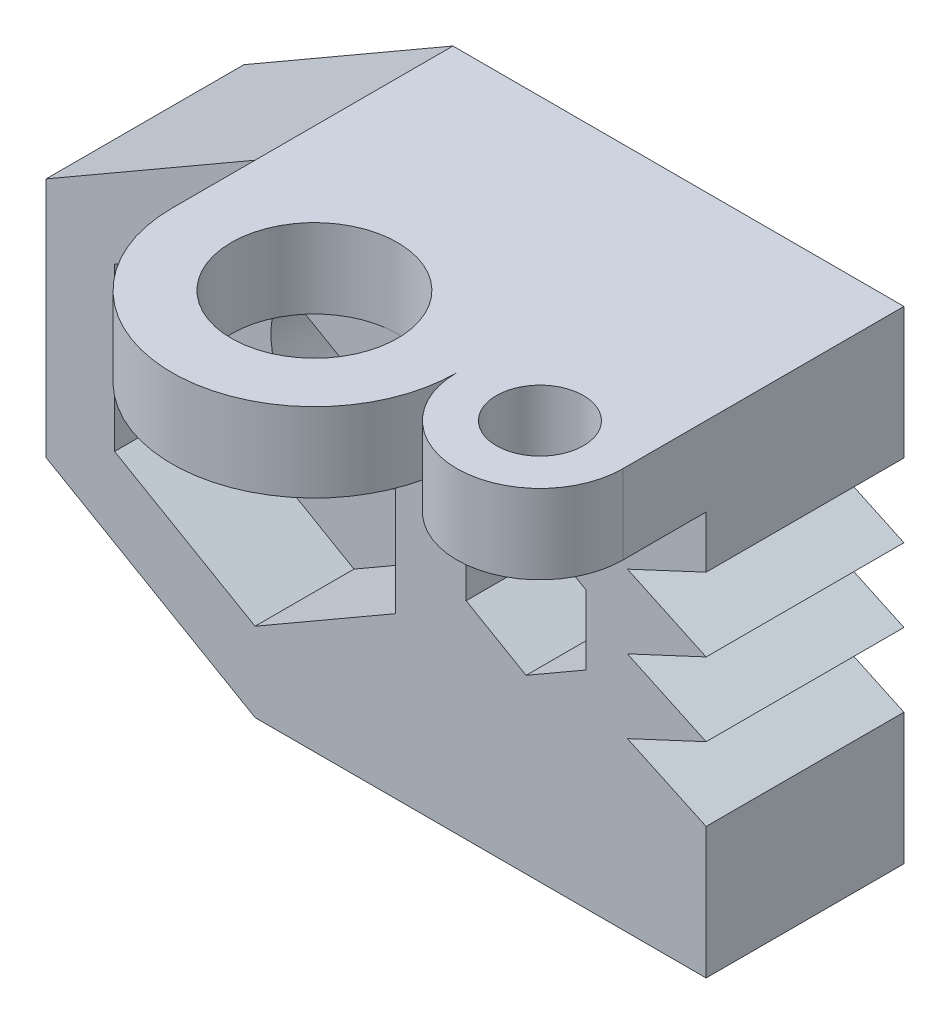
ISO-10303-21;
HEADER;
FILE_DESCRIPTION(('STEP AP214'),'2;1');
FILE_NAME('part.step','',(''),(''),'','','');
FILE_SCHEMA(('AUTOMOTIVE_DESIGN { 1 0 10303 214 1 1 1 1 }'));
ENDSEC;
DATA;
#1=APPLICATION_CONTEXT('core data for automotive mechanical design processes');
#2=APPLICATION_PROTOCOL_DEFINITION('international standard','automotive_design',2000,#1);
#3=PRODUCT_CONTEXT('',#1,'mechanical');
#4=PRODUCT('Part','Part','',(#3));
#5=PRODUCT_RELATED_PRODUCT_CATEGORY('part','',(#4));
#6=PRODUCT_DEFINITION_FORMATION('','',#4);
#7=PRODUCT_DEFINITION_CONTEXT('part definition',#1,'design');
#8=PRODUCT_DEFINITION('design','',#6,#7);
#9=PRODUCT_DEFINITION_SHAPE('','',#8);
#10=(LENGTH_UNIT() NAMED_UNIT(*) SI_UNIT(.MILLI.,.METRE.));
#11=(NAMED_UNIT(*) PLANE_ANGLE_UNIT() SI_UNIT($,.RADIAN.));
#12=(NAMED_UNIT(*) SI_UNIT($,.STERADIAN.) SOLID_ANGLE_UNIT());
#13=UNCERTAINTY_MEASURE_WITH_UNIT(LENGTH_MEASURE(1.E-05),#10,'distance_accuracy_value','');
#14=(GEOMETRIC_REPRESENTATION_CONTEXT(3) GLOBAL_UNCERTAINTY_ASSIGNED_CONTEXT((#13)) GLOBAL_UNIT_ASSIGNED_CONTEXT((#10,
#11,#12)) REPRESENTATION_CONTEXT('',''));
#15=CARTESIAN_POINT('',(0.,0.,0.));
#16=DIRECTION('',(0.,0.,1.));
#17=DIRECTION('',(1.,0.,0.));
#18=AXIS2_PLACEMENT_3D('',#15,#16,#17);
#19=CARTESIAN_POINT('',(22.8,-12.2,10.));
#20=DIRECTION('',(0.,0.,-1.));
#21=DIRECTION('',(-1.,0.,0.));
#22=AXIS2_PLACEMENT_3D('',#19,#20,#21);
#23=PLANE('',#22);
#24=DIRECTION('',(-0.866025403784439,0.499999999999999,0.));
#25=VECTOR('',#24,1.);
#26=CARTESIAN_POINT('',(16.7310889132455,1.75,10.));
#27=LINE('',#26,#25);
#28=CARTESIAN_POINT('',(16.7310889132455,1.75,10.));
#29=VERTEX_POINT('',#28);
#30=CARTESIAN_POINT('',(13.7,3.5,10.));
#31=VERTEX_POINT('',#30);
#32=EDGE_CURVE('E340',#29,#31,#27,.T.);
#33=ORIENTED_EDGE('',*,*,#32,.F.);
#34=DIRECTION('',(0.,1.,0.));
#35=VECTOR('',#34,1.);
#36=CARTESIAN_POINT('',(16.7310889132455,-1.75,10.));
#37=LINE('',#36,#35);
#38=CARTESIAN_POINT('',(16.7310889132455,-1.75,10.));
#39=VERTEX_POINT('',#38);
#40=EDGE_CURVE('E318',#39,#29,#37,.T.);
#41=ORIENTED_EDGE('',*,*,#40,.F.);
#42=DIRECTION('',(0.866025403784439,0.5,0.));
#43=VECTOR('',#42,1.);
#44=CARTESIAN_POINT('',(13.7,-3.5,10.));
#45=LINE('',#44,#43);
#46=CARTESIAN_POINT('',(13.7,-3.5,10.));
#47=VERTEX_POINT('',#46);
#48=EDGE_CURVE('E323',#47,#39,#45,.T.);
#49=ORIENTED_EDGE('',*,*,#48,.F.);
#50=DIRECTION('',(0.866025403784439,-0.5,0.));
#51=VECTOR('',#50,1.);
#52=CARTESIAN_POINT('',(10.6689110867545,-1.75,10.));
#53=LINE('',#52,#51);
#54=CARTESIAN_POINT('',(10.6689110867545,-1.75,10.));
#55=VERTEX_POINT('',#54);
#56=EDGE_CURVE('E349',#55,#47,#53,.T.);
#57=ORIENTED_EDGE('',*,*,#56,.F.);
#58=DIRECTION('',(0.,-1.,0.));
#59=VECTOR('',#58,1.);
#60=CARTESIAN_POINT('',(10.6689110867545,1.75,10.));
#61=LINE('',#60,#59);
#62=CARTESIAN_POINT('',(10.6689110867545,1.75,10.));
#63=VERTEX_POINT('',#62);
#64=EDGE_CURVE('E346',#63,#55,#61,.T.);
#65=ORIENTED_EDGE('',*,*,#64,.F.);
#66=DIRECTION('',(-0.866025403784438,-0.5,0.));
#67=VECTOR('',#66,1.);
#68=CARTESIAN_POINT('',(13.7,3.5,10.));
#69=LINE('',#68,#67);
#70=EDGE_CURVE('E343',#31,#63,#69,.T.);
#71=ORIENTED_EDGE('',*,*,#70,.F.);
#72=EDGE_LOOP('',(#33,#41,#49,#57,#65,#71));
#73=FACE_BOUND('',#72,.T.);
#74=DIRECTION('',(-0.90630778703665,-0.422618261740699,0.));
#75=VECTOR('',#74,1.);
#76=CARTESIAN_POINT('',(17.4165931832703,-0.655246825604867,10.));
#77=LINE('',#76,#75);
#78=CARTESIAN_POINT('',(22.8,1.855077,10.));
#79=VERTEX_POINT('',#78);
#80=CARTESIAN_POINT('',(18.8217745354219,0.,10.));
#81=VERTEX_POINT('',#80);
#82=EDGE_CURVE('E232',#79,#81,#77,.T.);
#83=ORIENTED_EDGE('',*,*,#82,.F.);
#84=DIRECTION('',(0.906307787036651,-0.422618261740698,0.));
#85=VECTOR('',#84,1.);
#86=CARTESIAN_POINT('',(28.1834068167297,-0.655246825604855,10.));
#87=LINE('',#86,#85);
#88=CARTESIAN_POINT('',(18.8217745354219,3.71015399999999,10.));
#89=VERTEX_POINT('',#88);
#90=EDGE_CURVE('E260',#89,#79,#87,.T.);
#91=ORIENTED_EDGE('',*,*,#90,.F.);
#92=DIRECTION('',(-0.90630778703665,-0.4226182617407,0.));
#93=VECTOR('',#92,1.);
#94=CARTESIAN_POINT('',(15.9955217558625,2.3922506850096,10.));
#95=LINE('',#94,#93);
#96=CARTESIAN_POINT('',(22.8,5.565231,10.));
#97=VERTEX_POINT('',#96);
#98=EDGE_CURVE('E263',#97,#89,#95,.T.);
#99=ORIENTED_EDGE('',*,*,#98,.F.);
#100=DIRECTION('',(0.,1.,0.));
#101=VECTOR('',#100,1.);
#102=CARTESIAN_POINT('',(22.8,12.2,10.));
#103=LINE('',#102,#101);
#104=CARTESIAN_POINT('',(22.8,8.20000000000001,10.));
#105=VERTEX_POINT('',#104);
#106=EDGE_CURVE('E428',#97,#105,#103,.T.);
#107=ORIENTED_EDGE('',*,*,#106,.T.);
#108=DIRECTION('',(1.,0.,0.));
#109=VECTOR('',#108,1.);
#110=CARTESIAN_POINT('',(22.8,8.20000000000001,10.));
#111=LINE('',#110,#109);
#112=CARTESIAN_POINT('',(7.2,8.2,10.));
#113=VERTEX_POINT('',#112);
#114=EDGE_CURVE('E61',#113,#105,#111,.T.);
#115=ORIENTED_EDGE('',*,*,#114,.F.);
#116=CARTESIAN_POINT('',(0.,8.2,10.));
#117=VERTEX_POINT('',#116);
#118=EDGE_CURVE('E315',#117,#113,#111,.T.);
#119=ORIENTED_EDGE('',*,*,#118,.F.);
#120=DIRECTION('',(-0.866025403784439,0.5,0.));
#121=VECTOR('',#120,1.);
#122=CARTESIAN_POINT('',(7.10140831103239,4.1,10.));
#123=LINE('',#122,#121);
#124=CARTESIAN_POINT('',(7.10140831103239,4.1,10.));
#125=VERTEX_POINT('',#124);
#126=EDGE_CURVE('E398',#125,#117,#123,.T.);
#127=ORIENTED_EDGE('',*,*,#126,.F.);
#128=DIRECTION('',(0.,1.,0.));
#129=VECTOR('',#128,1.);
#130=CARTESIAN_POINT('',(7.10140831103239,-4.1,10.));
#131=LINE('',#130,#129);
#132=CARTESIAN_POINT('',(7.10140831103239,-4.1,10.));
#133=VERTEX_POINT('',#132);
#134=EDGE_CURVE('E395',#133,#125,#131,.T.);
#135=ORIENTED_EDGE('',*,*,#134,.F.);
#136=DIRECTION('',(0.866025403784439,0.5,0.));
#137=VECTOR('',#136,1.);
#138=CARTESIAN_POINT('',(0.,-8.2,10.));
#139=LINE('',#138,#137);
#140=CARTESIAN_POINT('',(0.,-8.2,10.));
#141=VERTEX_POINT('',#140);
#142=EDGE_CURVE('E392',#141,#133,#139,.T.);
#143=ORIENTED_EDGE('',*,*,#142,.F.);
#144=DIRECTION('',(0.866025403784439,-0.5,0.));
#145=VECTOR('',#144,1.);
#146=CARTESIAN_POINT('',(-7.1014083110324,-4.1,10.));
#147=LINE('',#146,#145);
#148=CARTESIAN_POINT('',(-7.10140831103239,-4.1,10.));
#149=VERTEX_POINT('',#148);
#150=EDGE_CURVE('E389',#149,#141,#147,.T.);
#151=ORIENTED_EDGE('',*,*,#150,.F.);
#152=DIRECTION('',(0.,-1.,0.));
#153=VECTOR('',#152,1.);
#154=CARTESIAN_POINT('',(-7.1014083110324,4.1,10.));
#155=LINE('',#154,#153);
#156=CARTESIAN_POINT('',(-7.1014083110324,4.1,10.));
#157=VERTEX_POINT('',#156);
#158=EDGE_CURVE('E387',#157,#149,#155,.T.);
#159=ORIENTED_EDGE('',*,*,#158,.F.);
#160=DIRECTION('',(-0.866025403784439,-0.5,0.));
#161=VECTOR('',#160,1.);
#162=CARTESIAN_POINT('',(0.,8.2,10.));
#163=LINE('',#162,#161);
#164=EDGE_CURVE('E371',#117,#157,#163,.T.);
#165=ORIENTED_EDGE('',*,*,#164,.F.);
#166=DIRECTION('',(0.,1.,0.));
#167=VECTOR('',#166,1.);
#168=CARTESIAN_POINT('',(0.,-12.2,10.));
#169=LINE('',#168,#167);
#170=CARTESIAN_POINT('',(0.,12.2,10.));
#171=VERTEX_POINT('',#170);
#172=EDGE_CURVE('E316',#117,#171,#169,.T.);
#173=ORIENTED_EDGE('',*,*,#172,.T.);
#174=DIRECTION('',(-0.866025403784439,-0.5,0.));
#175=VECTOR('',#174,1.);
#176=CARTESIAN_POINT('',(0.,12.2,10.));
#177=LINE('',#176,#175);
#178=CARTESIAN_POINT('',(-10.5655099261702,6.1,10.));
#179=VERTEX_POINT('',#178);
#180=EDGE_CURVE('E427',#171,#179,#177,.T.);
#181=ORIENTED_EDGE('',*,*,#180,.T.);
#182=DIRECTION('',(0.,-1.,0.));
#183=VECTOR('',#182,1.);
#184=CARTESIAN_POINT('',(-10.5655099261702,6.1,10.));
#185=LINE('',#184,#183);
#186=CARTESIAN_POINT('',(-10.5655099261702,-6.1,10.));
#187=VERTEX_POINT('',#186);
#188=EDGE_CURVE('E430',#179,#187,#185,.T.);
#189=ORIENTED_EDGE('',*,*,#188,.T.);
#190=DIRECTION('',(0.866025403784439,-0.5,0.));
#191=VECTOR('',#190,1.);
#192=CARTESIAN_POINT('',(-10.5655099261702,-6.1,10.));
#193=LINE('',#192,#191);
#194=CARTESIAN_POINT('',(0.,-12.2,10.));
#195=VERTEX_POINT('',#194);
#196=EDGE_CURVE('E432',#187,#195,#193,.T.);
#197=ORIENTED_EDGE('',*,*,#196,.T.);
#198=DIRECTION('',(1.,0.,0.));
#199=VECTOR('',#198,1.);
#200=CARTESIAN_POINT('',(22.8,-12.2,10.));
#201=LINE('',#200,#199);
#202=CARTESIAN_POINT('',(22.8,-12.2,10.));
#203=VERTEX_POINT('',#202);
#204=EDGE_CURVE('E434',#195,#203,#201,.T.);
#205=ORIENTED_EDGE('',*,*,#204,.T.);
#206=CARTESIAN_POINT('',(22.8,-5.565231,10.));
#207=VERTEX_POINT('',#206);
#208=EDGE_CURVE('E424',#203,#207,#103,.T.);
#209=ORIENTED_EDGE('',*,*,#208,.T.);
#210=DIRECTION('',(0.906307787036651,-0.422618261740697,0.));
#211=VECTOR('',#210,1.);
#212=CARTESIAN_POINT('',(25.341263961914,-6.75024184683381,10.));
#213=LINE('',#212,#211);
#214=CARTESIAN_POINT('',(18.8217745354219,-3.71015400000001,10.));
#215=VERTEX_POINT('',#214);
#216=EDGE_CURVE('E53',#215,#207,#213,.T.);
#217=ORIENTED_EDGE('',*,*,#216,.F.);
#218=DIRECTION('',(-0.90630778703665,-0.4226182617407,0.));
#219=VECTOR('',#218,1.);
#220=CARTESIAN_POINT('',(18.8376646106781,-3.70274433621936,10.));
#221=LINE('',#220,#219);
#222=CARTESIAN_POINT('',(22.8,-1.85507700000001,10.));
#223=VERTEX_POINT('',#222);
#224=EDGE_CURVE('E273',#223,#215,#221,.T.);
#225=ORIENTED_EDGE('',*,*,#224,.F.);
#226=DIRECTION('',(0.906307787036649,-0.422618261740701,0.));
#227=VECTOR('',#226,1.);
#228=CARTESIAN_POINT('',(26.7623353893219,-3.70274433621937,10.));
#229=LINE('',#228,#227);
#230=EDGE_CURVE('E253',#81,#223,#229,.T.);
#231=ORIENTED_EDGE('',*,*,#230,.F.);
#232=EDGE_LOOP('',(#83,#91,#99,#107,#115,#119,#127,#135,#143,#151,#159,#165,#173,#181,#189,#197,
#205,#209,#217,#225,#231));
#233=FACE_BOUND('',#232,.T.);
#234=ADVANCED_FACE('F38',(#73,#233),#23,.F.);
#235=CARTESIAN_POINT('',(22.8,-12.2,0.));
#236=DIRECTION('',(0.,0.,-1.));
#237=DIRECTION('',(-1.,0.,0.));
#238=AXIS2_PLACEMENT_3D('',#235,#236,#237);
#239=PLANE('',#238);
#240=CARTESIAN_POINT('',(13.7,0.,0.));
#241=DIRECTION('',(0.,0.,1.));
#242=DIRECTION('',(1.,0.,0.));
#243=AXIS2_PLACEMENT_3D('',#240,#241,#242);
#244=CIRCLE('',#243,2.20000000000001);
#245=CARTESIAN_POINT('',(15.9,0.,0.));
#246=VERTEX_POINT('',#245);
#247=EDGE_CURVE('E417',#246,#246,#244,.T.);
#248=ORIENTED_EDGE('',*,*,#247,.T.);
#249=EDGE_LOOP('',(#248));
#250=FACE_BOUND('',#249,.T.);
#251=CARTESIAN_POINT('',(0.,0.,0.));
#252=DIRECTION('',(0.,0.,1.));
#253=DIRECTION('',(1.,0.,0.));
#254=AXIS2_PLACEMENT_3D('',#251,#252,#253);
#255=CIRCLE('',#254,4.2);
#256=CARTESIAN_POINT('',(4.2,0.,0.));
#257=VERTEX_POINT('',#256);
#258=EDGE_CURVE('E420',#257,#257,#255,.T.);
#259=ORIENTED_EDGE('',*,*,#258,.T.);
#260=EDGE_LOOP('',(#259));
#261=FACE_BOUND('',#260,.T.);
#262=DIRECTION('',(0.906307787036651,-0.422618261740698,0.));
#263=VECTOR('',#262,1.);
#264=CARTESIAN_POINT('',(25.4523023542834,0.618288100455125,0.));
#265=LINE('',#264,#263);
#266=CARTESIAN_POINT('',(18.8217745354219,3.71015399999999,0.));
#267=VERTEX_POINT('',#266);
#268=CARTESIAN_POINT('',(22.8,1.855077,0.));
#269=VERTEX_POINT('',#268);
#270=EDGE_CURVE('E249',#267,#269,#265,.T.);
#271=ORIENTED_EDGE('',*,*,#270,.T.);
#272=DIRECTION('',(-0.90630778703665,-0.422618261740699,0.));
#273=VECTOR('',#272,1.);
#274=CARTESIAN_POINT('',(16.8800078948424,-0.905460654852126,0.));
#275=LINE('',#274,#273);
#276=CARTESIAN_POINT('',(18.8217745354219,0.,0.));
#277=VERTEX_POINT('',#276);
#278=EDGE_CURVE('E229',#269,#277,#275,.T.);
#279=ORIENTED_EDGE('',*,*,#278,.T.);
#280=DIRECTION('',(0.906307787036649,-0.422618261740701,0.));
#281=VECTOR('',#280,1.);
#282=CARTESIAN_POINT('',(24.0312309268756,-2.42920941015938,0.));
#283=LINE('',#282,#281);
#284=CARTESIAN_POINT('',(22.8,-1.85507700000001,0.));
#285=VERTEX_POINT('',#284);
#286=EDGE_CURVE('E235',#277,#285,#283,.T.);
#287=ORIENTED_EDGE('',*,*,#286,.T.);
#288=DIRECTION('',(-0.90630778703665,-0.4226182617407,0.));
#289=VECTOR('',#288,1.);
#290=CARTESIAN_POINT('',(18.3010793222502,-3.95295816546662,0.));
#291=LINE('',#290,#289);
#292=CARTESIAN_POINT('',(18.8217745354219,-3.71015400000001,0.));
#293=VERTEX_POINT('',#292);
#294=EDGE_CURVE('E265',#285,#293,#291,.T.);
#295=ORIENTED_EDGE('',*,*,#294,.T.);
#296=DIRECTION('',(0.906307787036651,-0.422618261740697,0.));
#297=VECTOR('',#296,1.);
#298=CARTESIAN_POINT('',(22.6101594994678,-5.47670692077384,0.));
#299=LINE('',#298,#297);
#300=CARTESIAN_POINT('',(22.8,-5.565231,0.));
#301=VERTEX_POINT('',#300);
#302=EDGE_CURVE('E267',#293,#301,#299,.T.);
#303=ORIENTED_EDGE('',*,*,#302,.T.);
#304=DIRECTION('',(0.,1.,0.));
#305=VECTOR('',#304,1.);
#306=CARTESIAN_POINT('',(22.8,12.2,0.));
#307=LINE('',#306,#305);
#308=CARTESIAN_POINT('',(22.8,-12.2,0.));
#309=VERTEX_POINT('',#308);
#310=EDGE_CURVE('E437',#309,#301,#307,.T.);
#311=ORIENTED_EDGE('',*,*,#310,.F.);
#312=DIRECTION('',(1.,0.,0.));
#313=VECTOR('',#312,1.);
#314=CARTESIAN_POINT('',(22.8,-12.2,0.));
#315=LINE('',#314,#313);
#316=CARTESIAN_POINT('',(0.,-12.2,0.));
#317=VERTEX_POINT('',#316);
#318=EDGE_CURVE('E448',#317,#309,#315,.T.);
#319=ORIENTED_EDGE('',*,*,#318,.F.);
#320=DIRECTION('',(0.866025403784439,-0.5,0.));
#321=VECTOR('',#320,1.);
#322=CARTESIAN_POINT('',(-10.5655099261702,-6.1,0.));
#323=LINE('',#322,#321);
#324=CARTESIAN_POINT('',(-10.5655099261702,-6.1,0.));
#325=VERTEX_POINT('',#324);
#326=EDGE_CURVE('E446',#325,#317,#323,.T.);
#327=ORIENTED_EDGE('',*,*,#326,.F.);
#328=DIRECTION('',(0.,-1.,0.));
#329=VECTOR('',#328,1.);
#330=CARTESIAN_POINT('',(-10.5655099261702,6.1,0.));
#331=LINE('',#330,#329);
#332=CARTESIAN_POINT('',(-10.5655099261702,6.1,0.));
#333=VERTEX_POINT('',#332);
#334=EDGE_CURVE('E444',#333,#325,#331,.T.);
#335=ORIENTED_EDGE('',*,*,#334,.F.);
#336=DIRECTION('',(-0.866025403784439,-0.5,0.));
#337=VECTOR('',#336,1.);
#338=CARTESIAN_POINT('',(0.,12.2,0.));
#339=LINE('',#338,#337);
#340=CARTESIAN_POINT('',(0.,12.2,0.));
#341=VERTEX_POINT('',#340);
#342=EDGE_CURVE('E442',#341,#333,#339,.T.);
#343=ORIENTED_EDGE('',*,*,#342,.F.);
#344=DIRECTION('',(-1.,0.,0.));
#345=VECTOR('',#344,1.);
#346=CARTESIAN_POINT('',(0.,12.2,0.));
#347=LINE('',#346,#345);
#348=CARTESIAN_POINT('',(22.8,12.2,0.));
#349=VERTEX_POINT('',#348);
#350=EDGE_CURVE('E440',#349,#341,#347,.T.);
#351=ORIENTED_EDGE('',*,*,#350,.F.);
#352=CARTESIAN_POINT('',(22.8,5.565231,0.));
#353=VERTEX_POINT('',#352);
#354=EDGE_CURVE('E423',#353,#349,#307,.T.);
#355=ORIENTED_EDGE('',*,*,#354,.F.);
#356=DIRECTION('',(-0.90630778703665,-0.4226182617407,0.));
#357=VECTOR('',#356,1.);
#358=CARTESIAN_POINT('',(15.4589364674346,2.14203685576234,0.));
#359=LINE('',#358,#357);
#360=EDGE_CURVE('E255',#353,#267,#359,.T.);
#361=ORIENTED_EDGE('',*,*,#360,.T.);
#362=EDGE_LOOP('',(#271,#279,#287,#295,#303,#311,#319,#327,#335,#343,#351,#355,#361));
#363=FACE_BOUND('',#362,.T.);
#364=ADVANCED_FACE('F246',(#250,#261,#363),#239,.T.);
#365=CARTESIAN_POINT('',(22.8,12.2,10.));
#366=DIRECTION('',(-1.,0.,0.));
#367=DIRECTION('',(0.,-1.,0.));
#368=AXIS2_PLACEMENT_3D('',#365,#366,#367);
#369=PLANE('',#368);
#370=DIRECTION('',(0.,0.,1.));
#371=VECTOR('',#370,1.);
#372=CARTESIAN_POINT('',(22.8,5.565231,10.));
#373=LINE('',#372,#371);
#374=EDGE_CURVE('E12',#353,#97,#373,.T.);
#375=ORIENTED_EDGE('',*,*,#374,.F.);
#376=ORIENTED_EDGE('',*,*,#354,.T.);
#377=DIRECTION('',(0.,0.,-1.));
#378=VECTOR('',#377,1.);
#379=CARTESIAN_POINT('',(22.8,12.2,10.));
#380=LINE('',#379,#378);
#381=CARTESIAN_POINT('',(22.8,12.2,14.2));
#382=VERTEX_POINT('',#381);
#383=EDGE_CURVE('E464',#382,#349,#380,.T.);
#384=ORIENTED_EDGE('',*,*,#383,.F.);
#385=DIRECTION('',(0.,1.,0.));
#386=VECTOR('',#385,1.);
#387=CARTESIAN_POINT('',(22.8,8.20000000000001,14.2));
#388=LINE('',#387,#386);
#389=CARTESIAN_POINT('',(22.8,8.20000000000001,14.2));
#390=VERTEX_POINT('',#389);
#391=EDGE_CURVE('E307',#390,#382,#388,.T.);
#392=ORIENTED_EDGE('',*,*,#391,.F.);
#393=DIRECTION('',(0.,0.,-1.));
#394=VECTOR('',#393,1.);
#395=CARTESIAN_POINT('',(22.8,8.20000000000001,0.));
#396=LINE('',#395,#394);
#397=EDGE_CURVE('E297',#390,#105,#396,.T.);
#398=ORIENTED_EDGE('',*,*,#397,.T.);
#399=ORIENTED_EDGE('',*,*,#106,.F.);
#400=EDGE_LOOP('',(#375,#376,#384,#392,#398,#399));
#401=FACE_BOUND('',#400,.T.);
#402=ADVANCED_FACE('F40',(#401),#369,.F.);
#403=DIRECTION('',(0.,0.,-1.));
#404=VECTOR('',#403,1.);
#405=CARTESIAN_POINT('',(22.8,-5.565231,10.));
#406=LINE('',#405,#404);
#407=EDGE_CURVE('E467',#207,#301,#406,.T.);
#408=ORIENTED_EDGE('',*,*,#407,.F.);
#409=ORIENTED_EDGE('',*,*,#208,.F.);
#410=DIRECTION('',(0.,0.,-1.));
#411=VECTOR('',#410,1.);
#412=CARTESIAN_POINT('',(22.8,-12.2,10.));
#413=LINE('',#412,#411);
#414=EDGE_CURVE('E436',#203,#309,#413,.T.);
#415=ORIENTED_EDGE('',*,*,#414,.T.);
#416=ORIENTED_EDGE('',*,*,#310,.T.);
#417=EDGE_LOOP('',(#408,#409,#415,#416));
#418=FACE_BOUND('',#417,.T.);
#419=ADVANCED_FACE('F485',(#418),#369,.F.);
#420=CARTESIAN_POINT('',(13.7,0.,10.));
#421=DIRECTION('',(0.,0.,-1.));
#422=DIRECTION('',(-1.,0.,0.));
#423=AXIS2_PLACEMENT_3D('',#420,#421,#422);
#424=CYLINDRICAL_SURFACE('',#423,2.20000000000001);
#425=ORIENTED_EDGE('',*,*,#247,.F.);
#426=EDGE_LOOP('',(#425));
#427=FACE_BOUND('',#426,.T.);
#428=CARTESIAN_POINT('',(13.7,0.,5.));
#429=DIRECTION('',(0.,0.,1.));
#430=DIRECTION('',(1.,0.,0.));
#431=AXIS2_PLACEMENT_3D('',#428,#429,#430);
#432=CIRCLE('',#431,2.20000000000001);
#433=CARTESIAN_POINT('',(15.9,0.,5.));
#434=VERTEX_POINT('',#433);
#435=EDGE_CURVE('E356',#434,#434,#432,.T.);
#436=ORIENTED_EDGE('',*,*,#435,.T.);
#437=EDGE_LOOP('',(#436));
#438=FACE_BOUND('',#437,.T.);
#439=ADVANCED_FACE('F562',(#427,#438),#424,.F.);
#440=CARTESIAN_POINT('',(0.,0.,10.));
#441=DIRECTION('',(0.,0.,-1.));
#442=DIRECTION('',(-1.,0.,0.));
#443=AXIS2_PLACEMENT_3D('',#440,#441,#442);
#444=CYLINDRICAL_SURFACE('',#443,4.2);
#445=ORIENTED_EDGE('',*,*,#258,.F.);
#446=EDGE_LOOP('',(#445));
#447=FACE_BOUND('',#446,.T.);
#448=CARTESIAN_POINT('',(0.,0.,5.));
#449=DIRECTION('',(0.,0.,1.));
#450=DIRECTION('',(1.,0.,0.));
#451=AXIS2_PLACEMENT_3D('',#448,#449,#450);
#452=CIRCLE('',#451,4.2);
#453=CARTESIAN_POINT('',(4.2,0.,5.));
#454=VERTEX_POINT('',#453);
#455=EDGE_CURVE('E405',#454,#454,#452,.T.);
#456=ORIENTED_EDGE('',*,*,#455,.T.);
#457=EDGE_LOOP('',(#456));
#458=FACE_BOUND('',#457,.T.);
#459=ADVANCED_FACE('F546',(#447,#458),#444,.F.);
#460=CARTESIAN_POINT('',(0.,12.2,10.));
#461=DIRECTION('',(0.,-1.,0.));
#462=DIRECTION('',(1.,0.,0.));
#463=AXIS2_PLACEMENT_3D('',#460,#461,#462);
#464=PLANE('',#463);
#465=CARTESIAN_POINT('',(7.2,12.2,14.2));
#466=DIRECTION('',(0.,1.,0.));
#467=DIRECTION('',(-1.,0.,0.));
#468=AXIS2_PLACEMENT_3D('',#465,#466,#467);
#469=CIRCLE('',#468,4.2);
#470=CARTESIAN_POINT('',(3.,12.2,14.2));
#471=VERTEX_POINT('',#470);
#472=EDGE_CURVE('E279',#471,#471,#469,.T.);
#473=ORIENTED_EDGE('',*,*,#472,.F.);
#474=EDGE_LOOP('',(#473));
#475=FACE_BOUND('',#474,.T.);
#476=ORIENTED_EDGE('',*,*,#350,.T.);
#477=DIRECTION('',(0.,0.,-1.));
#478=VECTOR('',#477,1.);
#479=CARTESIAN_POINT('',(0.,12.2,10.));
#480=LINE('',#479,#478);
#481=EDGE_CURVE('E461',#171,#341,#480,.T.);
#482=ORIENTED_EDGE('',*,*,#481,.F.);
#483=DIRECTION('',(0.,0.,1.));
#484=VECTOR('',#483,1.);
#485=CARTESIAN_POINT('',(0.,12.2,0.));
#486=LINE('',#485,#484);
#487=CARTESIAN_POINT('',(0.,12.2,14.2));
#488=VERTEX_POINT('',#487);
#489=EDGE_CURVE('E285',#171,#488,#486,.T.);
#490=ORIENTED_EDGE('',*,*,#489,.T.);
#491=CARTESIAN_POINT('',(7.2,12.2,14.2));
#492=DIRECTION('',(0.,1.,0.));
#493=DIRECTION('',(-1.,0.,0.));
#494=AXIS2_PLACEMENT_3D('',#491,#492,#493);
#495=CIRCLE('',#494,7.2);
#496=CARTESIAN_POINT('',(14.4,12.2,14.2));
#497=VERTEX_POINT('',#496);
#498=EDGE_CURVE('E302',#488,#497,#495,.T.);
#499=ORIENTED_EDGE('',*,*,#498,.T.);
#500=CARTESIAN_POINT('',(18.6,12.2,14.2));
#501=DIRECTION('',(0.,1.,0.));
#502=DIRECTION('',(1.,0.,0.));
#503=AXIS2_PLACEMENT_3D('',#500,#501,#502);
#504=CIRCLE('',#503,4.2);
#505=EDGE_CURVE('E291',#497,#382,#504,.T.);
#506=ORIENTED_EDGE('',*,*,#505,.T.);
#507=ORIENTED_EDGE('',*,*,#383,.T.);
#508=EDGE_LOOP('',(#476,#482,#490,#499,#506,#507));
#509=FACE_BOUND('',#508,.T.);
#510=CARTESIAN_POINT('',(18.6,12.2,14.2));
#511=DIRECTION('',(0.,1.,0.));
#512=DIRECTION('',(-1.,0.,0.));
#513=AXIS2_PLACEMENT_3D('',#510,#511,#512);
#514=CIRCLE('',#513,2.2);
#515=CARTESIAN_POINT('',(16.4,12.2,14.2));
#516=VERTEX_POINT('',#515);
#517=EDGE_CURVE('E275',#516,#516,#514,.T.);
#518=ORIENTED_EDGE('',*,*,#517,.F.);
#519=EDGE_LOOP('',(#518));
#520=FACE_BOUND('',#519,.T.);
#521=ADVANCED_FACE('F511',(#475,#509,#520),#464,.F.);
#522=CARTESIAN_POINT('',(0.,12.2,10.));
#523=DIRECTION('',(0.5,-0.866025403784439,0.));
#524=DIRECTION('',(0.866025403784439,0.5,0.));
#525=AXIS2_PLACEMENT_3D('',#522,#523,#524);
#526=PLANE('',#525);
#527=ORIENTED_EDGE('',*,*,#342,.T.);
#528=DIRECTION('',(0.,0.,-1.));
#529=VECTOR('',#528,1.);
#530=CARTESIAN_POINT('',(-10.5655099261702,6.1,10.));
#531=LINE('',#530,#529);
#532=EDGE_CURVE('E458',#179,#333,#531,.T.);
#533=ORIENTED_EDGE('',*,*,#532,.F.);
#534=ORIENTED_EDGE('',*,*,#180,.F.);
#535=ORIENTED_EDGE('',*,*,#481,.T.);
#536=EDGE_LOOP('',(#527,#533,#534,#535));
#537=FACE_BOUND('',#536,.T.);
#538=ADVANCED_FACE('F505',(#537),#526,.F.);
#539=CARTESIAN_POINT('',(-10.5655099261702,6.1,10.));
#540=DIRECTION('',(1.,0.,0.));
#541=DIRECTION('',(0.,1.,0.));
#542=AXIS2_PLACEMENT_3D('',#539,#540,#541);
#543=PLANE('',#542);
#544=ORIENTED_EDGE('',*,*,#334,.T.);
#545=DIRECTION('',(0.,0.,-1.));
#546=VECTOR('',#545,1.);
#547=CARTESIAN_POINT('',(-10.5655099261702,-6.1,10.));
#548=LINE('',#547,#546);
#549=EDGE_CURVE('E455',#187,#325,#548,.T.);
#550=ORIENTED_EDGE('',*,*,#549,.F.);
#551=ORIENTED_EDGE('',*,*,#188,.F.);
#552=ORIENTED_EDGE('',*,*,#532,.T.);
#553=EDGE_LOOP('',(#544,#550,#551,#552));
#554=FACE_BOUND('',#553,.T.);
#555=ADVANCED_FACE('F501',(#554),#543,.F.);
#556=CARTESIAN_POINT('',(-10.5655099261702,-6.1,10.));
#557=DIRECTION('',(0.5,0.866025403784439,0.));
#558=DIRECTION('',(-0.866025403784439,0.5,0.));
#559=AXIS2_PLACEMENT_3D('',#556,#557,#558);
#560=PLANE('',#559);
#561=ORIENTED_EDGE('',*,*,#326,.T.);
#562=DIRECTION('',(0.,0.,-1.));
#563=VECTOR('',#562,1.);
#564=CARTESIAN_POINT('',(0.,-12.2,10.));
#565=LINE('',#564,#563);
#566=EDGE_CURVE('E452',#195,#317,#565,.T.);
#567=ORIENTED_EDGE('',*,*,#566,.F.);
#568=ORIENTED_EDGE('',*,*,#196,.F.);
#569=ORIENTED_EDGE('',*,*,#549,.T.);
#570=EDGE_LOOP('',(#561,#567,#568,#569));
#571=FACE_BOUND('',#570,.T.);
#572=ADVANCED_FACE('F496',(#571),#560,.F.);
#573=CARTESIAN_POINT('',(22.8,-12.2,10.));
#574=DIRECTION('',(0.,1.,0.));
#575=DIRECTION('',(0.,0.,1.));
#576=AXIS2_PLACEMENT_3D('',#573,#574,#575);
#577=PLANE('',#576);
#578=ORIENTED_EDGE('',*,*,#318,.T.);
#579=ORIENTED_EDGE('',*,*,#414,.F.);
#580=ORIENTED_EDGE('',*,*,#204,.F.);
#581=ORIENTED_EDGE('',*,*,#566,.T.);
#582=EDGE_LOOP('',(#578,#579,#580,#581));
#583=FACE_BOUND('',#582,.T.);
#584=ADVANCED_FACE('F490',(#583),#577,.F.);
#585=CARTESIAN_POINT('',(-7.1014083110324,4.1,5.));
#586=DIRECTION('',(-1.,0.,0.));
#587=DIRECTION('',(0.,-1.,0.));
#588=AXIS2_PLACEMENT_3D('',#585,#586,#587);
#589=PLANE('',#588);
#590=ORIENTED_EDGE('',*,*,#158,.T.);
#591=DIRECTION('',(0.,0.,1.));
#592=VECTOR('',#591,1.);
#593=CARTESIAN_POINT('',(-7.1014083110324,-4.1,5.));
#594=LINE('',#593,#592);
#595=CARTESIAN_POINT('',(-7.1014083110324,-4.1,5.));
#596=VERTEX_POINT('',#595);
#597=EDGE_CURVE('E386',#596,#149,#594,.T.);
#598=ORIENTED_EDGE('',*,*,#597,.F.);
#599=DIRECTION('',(0.,-1.,0.));
#600=VECTOR('',#599,1.);
#601=CARTESIAN_POINT('',(-7.1014083110324,4.1,5.));
#602=LINE('',#601,#600);
#603=CARTESIAN_POINT('',(-7.1014083110324,4.1,5.));
#604=VERTEX_POINT('',#603);
#605=EDGE_CURVE('E367',#604,#596,#602,.T.);
#606=ORIENTED_EDGE('',*,*,#605,.F.);
#607=DIRECTION('',(0.,0.,1.));
#608=VECTOR('',#607,1.);
#609=CARTESIAN_POINT('',(-7.1014083110324,4.1,5.));
#610=LINE('',#609,#608);
#611=EDGE_CURVE('E403',#604,#157,#610,.T.);
#612=ORIENTED_EDGE('',*,*,#611,.T.);
#613=EDGE_LOOP('',(#590,#598,#606,#612));
#614=FACE_BOUND('',#613,.T.);
#615=ADVANCED_FACE('F551',(#614),#589,.F.);
#616=CARTESIAN_POINT('',(0.,8.2,5.));
#617=DIRECTION('',(-0.5,0.866025403784439,0.));
#618=DIRECTION('',(-0.866025403784439,-0.5,0.));
#619=AXIS2_PLACEMENT_3D('',#616,#617,#618);
#620=PLANE('',#619);
#621=ORIENTED_EDGE('',*,*,#164,.T.);
#622=ORIENTED_EDGE('',*,*,#611,.F.);
#623=DIRECTION('',(-0.866025403784439,-0.5,0.));
#624=VECTOR('',#623,1.);
#625=CARTESIAN_POINT('',(0.,8.2,5.));
#626=LINE('',#625,#624);
#627=CARTESIAN_POINT('',(0.,8.2,5.));
#628=VERTEX_POINT('',#627);
#629=EDGE_CURVE('E383',#628,#604,#626,.T.);
#630=ORIENTED_EDGE('',*,*,#629,.F.);
#631=DIRECTION('',(0.,0.,1.));
#632=VECTOR('',#631,1.);
#633=CARTESIAN_POINT('',(0.,8.2,5.));
#634=LINE('',#633,#632);
#635=EDGE_CURVE('E406',#628,#117,#634,.T.);
#636=ORIENTED_EDGE('',*,*,#635,.T.);
#637=EDGE_LOOP('',(#621,#622,#630,#636));
#638=FACE_BOUND('',#637,.T.);
#639=ADVANCED_FACE('F577',(#638),#620,.F.);
#640=CARTESIAN_POINT('',(7.10140831103239,4.1,5.));
#641=DIRECTION('',(0.5,0.866025403784439,0.));
#642=DIRECTION('',(-0.866025403784439,0.5,0.));
#643=AXIS2_PLACEMENT_3D('',#640,#641,#642);
#644=PLANE('',#643);
#645=ORIENTED_EDGE('',*,*,#126,.T.);
#646=ORIENTED_EDGE('',*,*,#635,.F.);
#647=DIRECTION('',(-0.866025403784439,0.5,0.));
#648=VECTOR('',#647,1.);
#649=CARTESIAN_POINT('',(7.10140831103239,4.1,5.));
#650=LINE('',#649,#648);
#651=CARTESIAN_POINT('',(7.10140831103239,4.1,5.));
#652=VERTEX_POINT('',#651);
#653=EDGE_CURVE('E380',#652,#628,#650,.T.);
#654=ORIENTED_EDGE('',*,*,#653,.F.);
#655=DIRECTION('',(0.,0.,1.));
#656=VECTOR('',#655,1.);
#657=CARTESIAN_POINT('',(7.10140831103239,4.1,5.));
#658=LINE('',#657,#656);
#659=EDGE_CURVE('E409',#652,#125,#658,.T.);
#660=ORIENTED_EDGE('',*,*,#659,.T.);
#661=EDGE_LOOP('',(#645,#646,#654,#660));
#662=FACE_BOUND('',#661,.T.);
#663=ADVANCED_FACE('F582',(#662),#644,.F.);
#664=CARTESIAN_POINT('',(7.10140831103239,-4.1,5.));
#665=DIRECTION('',(1.,0.,0.));
#666=DIRECTION('',(0.,1.,0.));
#667=AXIS2_PLACEMENT_3D('',#664,#665,#666);
#668=PLANE('',#667);
#669=ORIENTED_EDGE('',*,*,#134,.T.);
#670=ORIENTED_EDGE('',*,*,#659,.F.);
#671=DIRECTION('',(0.,1.,0.));
#672=VECTOR('',#671,1.);
#673=CARTESIAN_POINT('',(7.10140831103239,-4.1,5.));
#674=LINE('',#673,#672);
#675=CARTESIAN_POINT('',(7.10140831103239,-4.1,5.));
#676=VERTEX_POINT('',#675);
#677=EDGE_CURVE('E377',#676,#652,#674,.T.);
#678=ORIENTED_EDGE('',*,*,#677,.F.);
#679=DIRECTION('',(0.,0.,1.));
#680=VECTOR('',#679,1.);
#681=CARTESIAN_POINT('',(7.10140831103239,-4.1,5.));
#682=LINE('',#681,#680);
#683=EDGE_CURVE('E411',#676,#133,#682,.T.);
#684=ORIENTED_EDGE('',*,*,#683,.T.);
#685=EDGE_LOOP('',(#669,#670,#678,#684));
#686=FACE_BOUND('',#685,.T.);
#687=ADVANCED_FACE('F637',(#686),#668,.F.);
#688=CARTESIAN_POINT('',(0.,-8.2,5.));
#689=DIRECTION('',(0.5,-0.866025403784439,0.));
#690=DIRECTION('',(0.866025403784439,0.5,0.));
#691=AXIS2_PLACEMENT_3D('',#688,#689,#690);
#692=PLANE('',#691);
#693=ORIENTED_EDGE('',*,*,#142,.T.);
#694=ORIENTED_EDGE('',*,*,#683,.F.);
#695=DIRECTION('',(0.866025403784439,0.5,0.));
#696=VECTOR('',#695,1.);
#697=CARTESIAN_POINT('',(0.,-8.2,5.));
#698=LINE('',#697,#696);
#699=CARTESIAN_POINT('',(0.,-8.2,5.));
#700=VERTEX_POINT('',#699);
#701=EDGE_CURVE('E374',#700,#676,#698,.T.);
#702=ORIENTED_EDGE('',*,*,#701,.F.);
#703=DIRECTION('',(0.,0.,1.));
#704=VECTOR('',#703,1.);
#705=CARTESIAN_POINT('',(0.,-8.2,5.));
#706=LINE('',#705,#704);
#707=EDGE_CURVE('E413',#700,#141,#706,.T.);
#708=ORIENTED_EDGE('',*,*,#707,.T.);
#709=EDGE_LOOP('',(#693,#694,#702,#708));
#710=FACE_BOUND('',#709,.T.);
#711=ADVANCED_FACE('F640',(#710),#692,.F.);
#712=CARTESIAN_POINT('',(-7.1014083110324,-4.1,5.));
#713=DIRECTION('',(-0.5,-0.866025403784438,0.));
#714=DIRECTION('',(0.866025403784439,-0.5,0.));
#715=AXIS2_PLACEMENT_3D('',#712,#713,#714);
#716=PLANE('',#715);
#717=ORIENTED_EDGE('',*,*,#150,.T.);
#718=ORIENTED_EDGE('',*,*,#707,.F.);
#719=DIRECTION('',(0.866025403784439,-0.5,0.));
#720=VECTOR('',#719,1.);
#721=CARTESIAN_POINT('',(-7.1014083110324,-4.1,5.));
#722=LINE('',#721,#720);
#723=EDGE_CURVE('E370',#596,#700,#722,.T.);
#724=ORIENTED_EDGE('',*,*,#723,.F.);
#725=ORIENTED_EDGE('',*,*,#597,.T.);
#726=EDGE_LOOP('',(#717,#718,#724,#725));
#727=FACE_BOUND('',#726,.T.);
#728=ADVANCED_FACE('F631',(#727),#716,.F.);
#729=CARTESIAN_POINT('',(-7.1014083110324,-4.1,5.));
#730=DIRECTION('',(0.,0.,1.));
#731=DIRECTION('',(1.,0.,0.));
#732=AXIS2_PLACEMENT_3D('',#729,#730,#731);
#733=PLANE('',#732);
#734=ORIENTED_EDGE('',*,*,#455,.F.);
#735=EDGE_LOOP('',(#734));
#736=FACE_BOUND('',#735,.T.);
#737=ORIENTED_EDGE('',*,*,#605,.T.);
#738=ORIENTED_EDGE('',*,*,#723,.T.);
#739=ORIENTED_EDGE('',*,*,#701,.T.);
#740=ORIENTED_EDGE('',*,*,#677,.T.);
#741=ORIENTED_EDGE('',*,*,#653,.T.);
#742=ORIENTED_EDGE('',*,*,#629,.T.);
#743=EDGE_LOOP('',(#737,#738,#739,#740,#741,#742));
#744=FACE_BOUND('',#743,.T.);
#745=ADVANCED_FACE('F627',(#736,#744),#733,.T.);
#746=CARTESIAN_POINT('',(16.7310889132455,-1.75,5.));
#747=DIRECTION('',(1.,0.,0.));
#748=DIRECTION('',(0.,0.,-1.));
#749=AXIS2_PLACEMENT_3D('',#746,#747,#748);
#750=PLANE('',#749);
#751=ORIENTED_EDGE('',*,*,#40,.T.);
#752=DIRECTION('',(0.,0.,1.));
#753=VECTOR('',#752,1.);
#754=CARTESIAN_POINT('',(16.7310889132455,1.75,5.));
#755=LINE('',#754,#753);
#756=CARTESIAN_POINT('',(16.7310889132455,1.75,5.));
#757=VERTEX_POINT('',#756);
#758=EDGE_CURVE('E338',#757,#29,#755,.T.);
#759=ORIENTED_EDGE('',*,*,#758,.F.);
#760=DIRECTION('',(0.,1.,0.));
#761=VECTOR('',#760,1.);
#762=CARTESIAN_POINT('',(16.7310889132455,-1.75,5.));
#763=LINE('',#762,#761);
#764=CARTESIAN_POINT('',(16.7310889132455,-1.75,5.));
#765=VERTEX_POINT('',#764);
#766=EDGE_CURVE('E319',#765,#757,#763,.T.);
#767=ORIENTED_EDGE('',*,*,#766,.F.);
#768=DIRECTION('',(0.,0.,1.));
#769=VECTOR('',#768,1.);
#770=CARTESIAN_POINT('',(16.7310889132455,-1.75,5.));
#771=LINE('',#770,#769);
#772=EDGE_CURVE('E354',#765,#39,#771,.T.);
#773=ORIENTED_EDGE('',*,*,#772,.T.);
#774=EDGE_LOOP('',(#751,#759,#767,#773));
#775=FACE_BOUND('',#774,.T.);
#776=ADVANCED_FACE('F609',(#775),#750,.F.);
#777=CARTESIAN_POINT('',(13.7,-3.5,5.));
#778=DIRECTION('',(0.5,-0.866025403784439,0.));
#779=DIRECTION('',(0.866025403784439,0.5,0.));
#780=AXIS2_PLACEMENT_3D('',#777,#778,#779);
#781=PLANE('',#780);
#782=ORIENTED_EDGE('',*,*,#48,.T.);
#783=ORIENTED_EDGE('',*,*,#772,.F.);
#784=DIRECTION('',(0.866025403784439,0.5,0.));
#785=VECTOR('',#784,1.);
#786=CARTESIAN_POINT('',(13.7,-3.5,5.));
#787=LINE('',#786,#785);
#788=CARTESIAN_POINT('',(13.7,-3.5,5.));
#789=VERTEX_POINT('',#788);
#790=EDGE_CURVE('E335',#789,#765,#787,.T.);
#791=ORIENTED_EDGE('',*,*,#790,.F.);
#792=DIRECTION('',(0.,0.,1.));
#793=VECTOR('',#792,1.);
#794=CARTESIAN_POINT('',(13.7,-3.5,5.));
#795=LINE('',#794,#793);
#796=EDGE_CURVE('E357',#789,#47,#795,.T.);
#797=ORIENTED_EDGE('',*,*,#796,.T.);
#798=EDGE_LOOP('',(#782,#783,#791,#797));
#799=FACE_BOUND('',#798,.T.);
#800=ADVANCED_FACE('F605',(#799),#781,.F.);
#801=CARTESIAN_POINT('',(10.6689110867545,-1.75,5.));
#802=DIRECTION('',(-0.5,-0.866025403784439,0.));
#803=DIRECTION('',(0.866025403784439,-0.5,0.));
#804=AXIS2_PLACEMENT_3D('',#801,#802,#803);
#805=PLANE('',#804);
#806=ORIENTED_EDGE('',*,*,#56,.T.);
#807=ORIENTED_EDGE('',*,*,#796,.F.);
#808=DIRECTION('',(0.866025403784439,-0.5,0.));
#809=VECTOR('',#808,1.);
#810=CARTESIAN_POINT('',(10.6689110867545,-1.75,5.));
#811=LINE('',#810,#809);
#812=CARTESIAN_POINT('',(10.6689110867545,-1.75,5.));
#813=VERTEX_POINT('',#812);
#814=EDGE_CURVE('E332',#813,#789,#811,.T.);
#815=ORIENTED_EDGE('',*,*,#814,.F.);
#816=DIRECTION('',(0.,0.,1.));
#817=VECTOR('',#816,1.);
#818=CARTESIAN_POINT('',(10.6689110867545,-1.75,5.));
#819=LINE('',#818,#817);
#820=EDGE_CURVE('E359',#813,#55,#819,.T.);
#821=ORIENTED_EDGE('',*,*,#820,.T.);
#822=EDGE_LOOP('',(#806,#807,#815,#821));
#823=FACE_BOUND('',#822,.T.);
#824=ADVANCED_FACE('F608',(#823),#805,.F.);
#825=CARTESIAN_POINT('',(10.6689110867545,1.75,5.));
#826=DIRECTION('',(-1.,0.,0.));
#827=DIRECTION('',(0.,0.,1.));
#828=AXIS2_PLACEMENT_3D('',#825,#826,#827);
#829=PLANE('',#828);
#830=ORIENTED_EDGE('',*,*,#64,.T.);
#831=ORIENTED_EDGE('',*,*,#820,.F.);
#832=DIRECTION('',(0.,-1.,0.));
#833=VECTOR('',#832,1.);
#834=CARTESIAN_POINT('',(10.6689110867545,1.75,5.));
#835=LINE('',#834,#833);
#836=CARTESIAN_POINT('',(10.6689110867545,1.75,5.));
#837=VERTEX_POINT('',#836);
#838=EDGE_CURVE('E329',#837,#813,#835,.T.);
#839=ORIENTED_EDGE('',*,*,#838,.F.);
#840=DIRECTION('',(0.,0.,1.));
#841=VECTOR('',#840,1.);
#842=CARTESIAN_POINT('',(10.6689110867545,1.75,5.));
#843=LINE('',#842,#841);
#844=EDGE_CURVE('E361',#837,#63,#843,.T.);
#845=ORIENTED_EDGE('',*,*,#844,.T.);
#846=EDGE_LOOP('',(#830,#831,#839,#845));
#847=FACE_BOUND('',#846,.T.);
#848=ADVANCED_FACE('F613',(#847),#829,.F.);
#849=CARTESIAN_POINT('',(13.7,3.5,5.));
#850=DIRECTION('',(-0.5,0.866025403784438,0.));
#851=DIRECTION('',(-0.866025403784439,-0.5,0.));
#852=AXIS2_PLACEMENT_3D('',#849,#850,#851);
#853=PLANE('',#852);
#854=ORIENTED_EDGE('',*,*,#70,.T.);
#855=ORIENTED_EDGE('',*,*,#844,.F.);
#856=DIRECTION('',(-0.866025403784438,-0.5,0.));
#857=VECTOR('',#856,1.);
#858=CARTESIAN_POINT('',(13.7,3.5,5.));
#859=LINE('',#858,#857);
#860=CARTESIAN_POINT('',(13.7,3.5,5.));
#861=VERTEX_POINT('',#860);
#862=EDGE_CURVE('E326',#861,#837,#859,.T.);
#863=ORIENTED_EDGE('',*,*,#862,.F.);
#864=DIRECTION('',(0.,0.,1.));
#865=VECTOR('',#864,1.);
#866=CARTESIAN_POINT('',(13.7,3.5,5.));
#867=LINE('',#866,#865);
#868=EDGE_CURVE('E363',#861,#31,#867,.T.);
#869=ORIENTED_EDGE('',*,*,#868,.T.);
#870=EDGE_LOOP('',(#854,#855,#863,#869));
#871=FACE_BOUND('',#870,.T.);
#872=ADVANCED_FACE('F617',(#871),#853,.F.);
#873=CARTESIAN_POINT('',(16.7310889132455,1.75,5.));
#874=DIRECTION('',(0.499999999999999,0.866025403784439,0.));
#875=DIRECTION('',(-0.866025403784439,0.499999999999999,0.));
#876=AXIS2_PLACEMENT_3D('',#873,#874,#875);
#877=PLANE('',#876);
#878=ORIENTED_EDGE('',*,*,#32,.T.);
#879=ORIENTED_EDGE('',*,*,#868,.F.);
#880=DIRECTION('',(-0.866025403784439,0.499999999999999,0.));
#881=VECTOR('',#880,1.);
#882=CARTESIAN_POINT('',(16.7310889132455,1.75,5.));
#883=LINE('',#882,#881);
#884=EDGE_CURVE('E322',#757,#861,#883,.T.);
#885=ORIENTED_EDGE('',*,*,#884,.F.);
#886=ORIENTED_EDGE('',*,*,#758,.T.);
#887=EDGE_LOOP('',(#878,#879,#885,#886));
#888=FACE_BOUND('',#887,.T.);
#889=ADVANCED_FACE('F603',(#888),#877,.F.);
#890=CARTESIAN_POINT('',(16.7310889132455,1.75,5.));
#891=DIRECTION('',(0.,0.,1.));
#892=DIRECTION('',(1.,0.,0.));
#893=AXIS2_PLACEMENT_3D('',#890,#891,#892);
#894=PLANE('',#893);
#895=ORIENTED_EDGE('',*,*,#435,.F.);
#896=EDGE_LOOP('',(#895));
#897=FACE_BOUND('',#896,.T.);
#898=ORIENTED_EDGE('',*,*,#766,.T.);
#899=ORIENTED_EDGE('',*,*,#884,.T.);
#900=ORIENTED_EDGE('',*,*,#862,.T.);
#901=ORIENTED_EDGE('',*,*,#838,.T.);
#902=ORIENTED_EDGE('',*,*,#814,.T.);
#903=ORIENTED_EDGE('',*,*,#790,.T.);
#904=EDGE_LOOP('',(#898,#899,#900,#901,#902,#903));
#905=FACE_BOUND('',#904,.T.);
#906=ADVANCED_FACE('F600',(#897,#905),#894,.T.);
#907=CARTESIAN_POINT('',(0.,8.2,0.));
#908=DIRECTION('',(-1.,0.,0.));
#909=DIRECTION('',(0.,-1.,0.));
#910=AXIS2_PLACEMENT_3D('',#907,#908,#909);
#911=PLANE('',#910);
#912=ORIENTED_EDGE('',*,*,#172,.F.);
#913=DIRECTION('',(0.,0.,1.));
#914=VECTOR('',#913,1.);
#915=CARTESIAN_POINT('',(0.,8.2,0.));
#916=LINE('',#915,#914);
#917=CARTESIAN_POINT('',(0.,8.2,14.2));
#918=VERTEX_POINT('',#917);
#919=EDGE_CURVE('E288',#117,#918,#916,.T.);
#920=ORIENTED_EDGE('',*,*,#919,.T.);
#921=DIRECTION('',(0.,1.,0.));
#922=VECTOR('',#921,1.);
#923=CARTESIAN_POINT('',(0.,8.2,14.2));
#924=LINE('',#923,#922);
#925=EDGE_CURVE('E300',#918,#488,#924,.T.);
#926=ORIENTED_EDGE('',*,*,#925,.T.);
#927=ORIENTED_EDGE('',*,*,#489,.F.);
#928=EDGE_LOOP('',(#912,#920,#926,#927));
#929=FACE_BOUND('',#928,.T.);
#930=ADVANCED_FACE('F586',(#929),#911,.T.);
#931=CARTESIAN_POINT('',(7.2,8.2,14.2));
#932=DIRECTION('',(0.,1.,0.));
#933=DIRECTION('',(-1.,0.,0.));
#934=AXIS2_PLACEMENT_3D('',#931,#932,#933);
#935=PLANE('',#934);
#936=CARTESIAN_POINT('',(18.6,8.2,14.2));
#937=DIRECTION('',(0.,1.,0.));
#938=DIRECTION('',(-1.,0.,0.));
#939=AXIS2_PLACEMENT_3D('',#936,#937,#938);
#940=CIRCLE('',#939,2.2);
#941=CARTESIAN_POINT('',(16.4,8.2,14.2));
#942=VERTEX_POINT('',#941);
#943=EDGE_CURVE('E276',#942,#942,#940,.T.);
#944=ORIENTED_EDGE('',*,*,#943,.T.);
#945=EDGE_LOOP('',(#944));
#946=FACE_BOUND('',#945,.T.);
#947=ORIENTED_EDGE('',*,*,#919,.F.);
#948=ORIENTED_EDGE('',*,*,#118,.T.);
#949=CARTESIAN_POINT('',(7.2,8.2,14.2));
#950=DIRECTION('',(0.,1.,0.));
#951=DIRECTION('',(-1.,0.,0.));
#952=AXIS2_PLACEMENT_3D('',#949,#950,#951);
#953=CIRCLE('',#952,4.2);
#954=EDGE_CURVE('E282',#113,#113,#953,.T.);
#955=ORIENTED_EDGE('',*,*,#954,.T.);
#956=ORIENTED_EDGE('',*,*,#114,.T.);
#957=ORIENTED_EDGE('',*,*,#397,.F.);
#958=CARTESIAN_POINT('',(18.6,8.2,14.2));
#959=DIRECTION('',(0.,1.,0.));
#960=DIRECTION('',(1.,0.,0.));
#961=AXIS2_PLACEMENT_3D('',#958,#959,#960);
#962=CIRCLE('',#961,4.2);
#963=CARTESIAN_POINT('',(14.4,8.2,14.2));
#964=VERTEX_POINT('',#963);
#965=EDGE_CURVE('E294',#964,#390,#962,.T.);
#966=ORIENTED_EDGE('',*,*,#965,.F.);
#967=CARTESIAN_POINT('',(7.2,8.2,14.2));
#968=DIRECTION('',(0.,1.,0.));
#969=DIRECTION('',(-1.,0.,0.));
#970=AXIS2_PLACEMENT_3D('',#967,#968,#969);
#971=CIRCLE('',#970,7.2);
#972=EDGE_CURVE('E290',#918,#964,#971,.T.);
#973=ORIENTED_EDGE('',*,*,#972,.F.);
#974=EDGE_LOOP('',(#947,#948,#955,#956,#957,#966,#973));
#975=FACE_BOUND('',#974,.T.);
#976=ADVANCED_FACE('F523',(#946,#975),#935,.F.);
#977=CARTESIAN_POINT('',(18.6,8.2,14.2));
#978=DIRECTION('',(0.,1.,0.));
#979=DIRECTION('',(-1.,0.,0.));
#980=AXIS2_PLACEMENT_3D('',#977,#978,#979);
#981=CYLINDRICAL_SURFACE('',#980,4.2);
#982=ORIENTED_EDGE('',*,*,#505,.F.);
#983=DIRECTION('',(0.,1.,0.));
#984=VECTOR('',#983,1.);
#985=CARTESIAN_POINT('',(14.4,8.2,14.2));
#986=LINE('',#985,#984);
#987=EDGE_CURVE('E310',#964,#497,#986,.T.);
#988=ORIENTED_EDGE('',*,*,#987,.F.);
#989=ORIENTED_EDGE('',*,*,#965,.T.);
#990=ORIENTED_EDGE('',*,*,#391,.T.);
#991=EDGE_LOOP('',(#982,#988,#989,#990));
#992=FACE_BOUND('',#991,.T.);
#993=ADVANCED_FACE('F517',(#992),#981,.T.);
#994=CARTESIAN_POINT('',(7.2,8.2,14.2));
#995=DIRECTION('',(0.,1.,0.));
#996=DIRECTION('',(-1.,0.,0.));
#997=AXIS2_PLACEMENT_3D('',#994,#995,#996);
#998=CYLINDRICAL_SURFACE('',#997,7.2);
#999=ORIENTED_EDGE('',*,*,#498,.F.);
#1000=ORIENTED_EDGE('',*,*,#925,.F.);
#1001=ORIENTED_EDGE('',*,*,#972,.T.);
#1002=ORIENTED_EDGE('',*,*,#987,.T.);
#1003=EDGE_LOOP('',(#999,#1000,#1001,#1002));
#1004=FACE_BOUND('',#1003,.T.);
#1005=ADVANCED_FACE('F570',(#1004),#998,.T.);
#1006=CARTESIAN_POINT('',(7.2,8.2,14.2));
#1007=DIRECTION('',(0.,1.,0.));
#1008=DIRECTION('',(-1.,0.,0.));
#1009=AXIS2_PLACEMENT_3D('',#1006,#1007,#1008);
#1010=CYLINDRICAL_SURFACE('',#1009,4.2);
#1011=ORIENTED_EDGE('',*,*,#472,.T.);
#1012=EDGE_LOOP('',(#1011));
#1013=FACE_BOUND('',#1012,.T.);
#1014=ORIENTED_EDGE('',*,*,#954,.F.);
#1015=EDGE_LOOP('',(#1014));
#1016=FACE_BOUND('',#1015,.T.);
#1017=ADVANCED_FACE('F566',(#1013,#1016),#1010,.F.);
#1018=CARTESIAN_POINT('',(18.6,8.2,14.2));
#1019=DIRECTION('',(0.,1.,0.));
#1020=DIRECTION('',(-1.,0.,0.));
#1021=AXIS2_PLACEMENT_3D('',#1018,#1019,#1020);
#1022=CYLINDRICAL_SURFACE('',#1021,2.2);
#1023=ORIENTED_EDGE('',*,*,#943,.F.);
#1024=EDGE_LOOP('',(#1023));
#1025=FACE_BOUND('',#1024,.T.);
#1026=ORIENTED_EDGE('',*,*,#517,.T.);
#1027=EDGE_LOOP('',(#1026));
#1028=FACE_BOUND('',#1027,.T.);
#1029=ADVANCED_FACE('F569',(#1025,#1028),#1022,.F.);
#1030=CARTESIAN_POINT('',(18.3010793222502,-3.95295816546662,21.4));
#1031=DIRECTION('',(0.4226182617407,-0.90630778703665,0.));
#1032=DIRECTION('',(0.90630778703665,0.4226182617407,0.));
#1033=AXIS2_PLACEMENT_3D('',#1030,#1031,#1032);
#1034=PLANE('',#1033);
#1035=ORIENTED_EDGE('',*,*,#224,.T.);
#1036=DIRECTION('',(0.,0.,-1.));
#1037=VECTOR('',#1036,1.);
#1038=CARTESIAN_POINT('',(18.8217745354219,-3.71015400000001,21.4));
#1039=LINE('',#1038,#1037);
#1040=EDGE_CURVE('E270',#215,#293,#1039,.T.);
#1041=ORIENTED_EDGE('',*,*,#1040,.T.);
#1042=ORIENTED_EDGE('',*,*,#294,.F.);
#1043=DIRECTION('',(0.,0.,1.));
#1044=VECTOR('',#1043,1.);
#1045=CARTESIAN_POINT('',(22.8,-1.85507700000001,10.));
#1046=LINE('',#1045,#1044);
#1047=EDGE_CURVE('E240',#285,#223,#1046,.T.);
#1048=ORIENTED_EDGE('',*,*,#1047,.T.);
#1049=EDGE_LOOP('',(#1035,#1041,#1042,#1048));
#1050=FACE_BOUND('',#1049,.T.);
#1051=ADVANCED_FACE('F480',(#1050),#1034,.T.);
#1052=CARTESIAN_POINT('',(22.6101594994678,-5.47670692077384,21.4));
#1053=DIRECTION('',(0.422618261740697,0.906307787036651,0.));
#1054=DIRECTION('',(-0.906307787036651,0.422618261740697,0.));
#1055=AXIS2_PLACEMENT_3D('',#1052,#1053,#1054);
#1056=PLANE('',#1055);
#1057=ORIENTED_EDGE('',*,*,#216,.T.);
#1058=ORIENTED_EDGE('',*,*,#407,.T.);
#1059=ORIENTED_EDGE('',*,*,#302,.F.);
#1060=ORIENTED_EDGE('',*,*,#1040,.F.);
#1061=EDGE_LOOP('',(#1057,#1058,#1059,#1060));
#1062=FACE_BOUND('',#1061,.T.);
#1063=ADVANCED_FACE('F528',(#1062),#1056,.T.);
#1064=CARTESIAN_POINT('',(15.4589364674346,2.14203685576234,21.4));
#1065=DIRECTION('',(0.4226182617407,-0.90630778703665,0.));
#1066=DIRECTION('',(0.90630778703665,0.4226182617407,0.));
#1067=AXIS2_PLACEMENT_3D('',#1064,#1065,#1066);
#1068=PLANE('',#1067);
#1069=ORIENTED_EDGE('',*,*,#98,.T.);
#1070=DIRECTION('',(0.,0.,-1.));
#1071=VECTOR('',#1070,1.);
#1072=CARTESIAN_POINT('',(18.8217745354219,3.71015399999999,21.4));
#1073=LINE('',#1072,#1071);
#1074=EDGE_CURVE('E258',#89,#267,#1073,.T.);
#1075=ORIENTED_EDGE('',*,*,#1074,.T.);
#1076=ORIENTED_EDGE('',*,*,#360,.F.);
#1077=ORIENTED_EDGE('',*,*,#374,.T.);
#1078=EDGE_LOOP('',(#1069,#1075,#1076,#1077));
#1079=FACE_BOUND('',#1078,.T.);
#1080=ADVANCED_FACE('F526',(#1079),#1068,.T.);
#1081=CARTESIAN_POINT('',(25.4523023542834,0.618288100455125,21.4));
#1082=DIRECTION('',(0.422618261740698,0.906307787036651,0.));
#1083=DIRECTION('',(-0.906307787036651,0.422618261740698,0.));
#1084=AXIS2_PLACEMENT_3D('',#1081,#1082,#1083);
#1085=PLANE('',#1084);
#1086=ORIENTED_EDGE('',*,*,#90,.T.);
#1087=DIRECTION('',(0.,0.,-1.));
#1088=VECTOR('',#1087,1.);
#1089=CARTESIAN_POINT('',(22.8,1.855077,10.));
#1090=LINE('',#1089,#1088);
#1091=EDGE_CURVE('E46',#79,#269,#1090,.T.);
#1092=ORIENTED_EDGE('',*,*,#1091,.T.);
#1093=ORIENTED_EDGE('',*,*,#270,.F.);
#1094=ORIENTED_EDGE('',*,*,#1074,.F.);
#1095=EDGE_LOOP('',(#1086,#1092,#1093,#1094));
#1096=FACE_BOUND('',#1095,.T.);
#1097=ADVANCED_FACE('F474',(#1096),#1085,.T.);
#1098=CARTESIAN_POINT('',(24.0312309268756,-2.42920941015938,21.4));
#1099=DIRECTION('',(0.422618261740701,0.906307787036649,0.));
#1100=DIRECTION('',(-0.906307787036649,0.422618261740701,0.));
#1101=AXIS2_PLACEMENT_3D('',#1098,#1099,#1100);
#1102=PLANE('',#1101);
#1103=ORIENTED_EDGE('',*,*,#230,.T.);
#1104=ORIENTED_EDGE('',*,*,#1047,.F.);
#1105=ORIENTED_EDGE('',*,*,#286,.F.);
#1106=DIRECTION('',(0.,0.,-1.));
#1107=VECTOR('',#1106,1.);
#1108=CARTESIAN_POINT('',(18.8217745354219,0.,21.4));
#1109=LINE('',#1108,#1107);
#1110=EDGE_CURVE('E225',#81,#277,#1109,.T.);
#1111=ORIENTED_EDGE('',*,*,#1110,.F.);
#1112=EDGE_LOOP('',(#1103,#1104,#1105,#1111));
#1113=FACE_BOUND('',#1112,.T.);
#1114=ADVANCED_FACE('F238',(#1113),#1102,.T.);
#1115=CARTESIAN_POINT('',(16.8800078948424,-0.905460654852126,21.4));
#1116=DIRECTION('',(0.422618261740699,-0.90630778703665,0.));
#1117=DIRECTION('',(0.90630778703665,0.422618261740699,0.));
#1118=AXIS2_PLACEMENT_3D('',#1115,#1116,#1117);
#1119=PLANE('',#1118);
#1120=ORIENTED_EDGE('',*,*,#82,.T.);
#1121=ORIENTED_EDGE('',*,*,#1110,.T.);
#1122=ORIENTED_EDGE('',*,*,#278,.F.);
#1123=ORIENTED_EDGE('',*,*,#1091,.F.);
#1124=EDGE_LOOP('',(#1120,#1121,#1122,#1123));
#1125=FACE_BOUND('',#1124,.T.);
#1126=ADVANCED_FACE('F227',(#1125),#1119,.T.);
#1127=CLOSED_SHELL('',(#234,#364,#402,#419,#439,#459,#521,#538,#555,#572,#584,#615,#639,#663,
#687,#711,#728,#745,#776,#800,#824,#848,#872,#889,#906,#930,#976,#993,#1005,#1017,#1029,#1051,
#1063,#1080,#1097,#1114,#1126));
#1128=MANIFOLD_SOLID_BREP('B2',#1127);
#1129=ADVANCED_BREP_SHAPE_REPRESENTATION('',(#18,#1128),#14);
#1130=SHAPE_DEFINITION_REPRESENTATION(#9,#1129);
ENDSEC;
END-ISO-10303-21;
